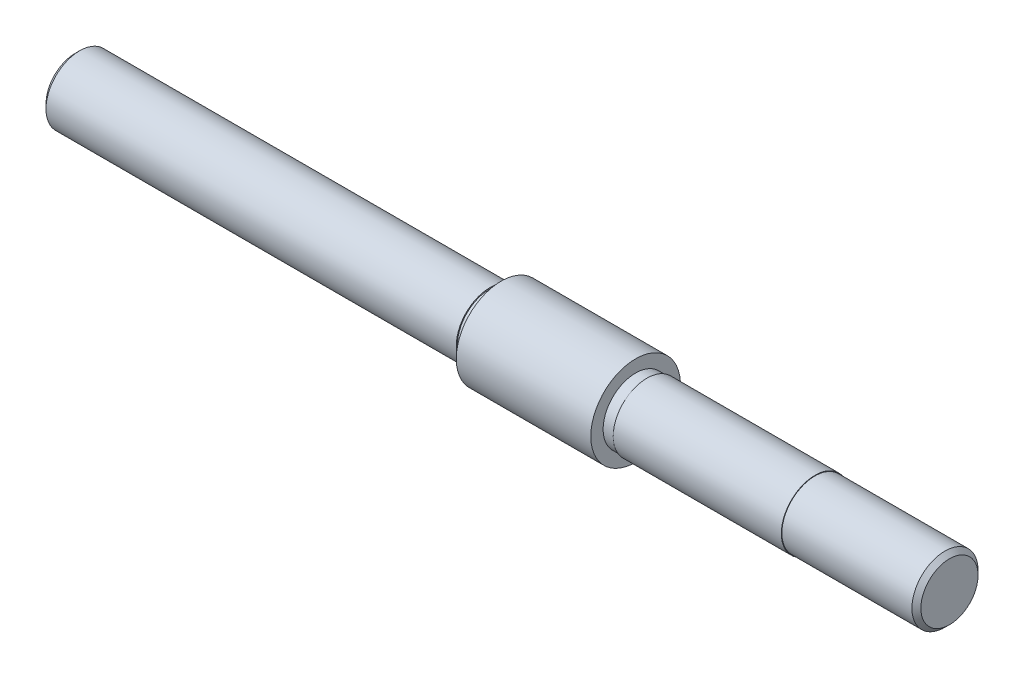
ISO-10303-21;
HEADER;
FILE_DESCRIPTION(('STEP AP214'),'2;1');
FILE_NAME('part.step','',(''),(''),'','','');
FILE_SCHEMA(('AUTOMOTIVE_DESIGN { 1 0 10303 214 1 1 1 1 }'));
ENDSEC;
DATA;
#1=APPLICATION_CONTEXT('core data for automotive mechanical design processes');
#2=APPLICATION_PROTOCOL_DEFINITION('international standard','automotive_design',2000,#1);
#3=PRODUCT_CONTEXT('',#1,'mechanical');
#4=PRODUCT('Part','Part','',(#3));
#5=PRODUCT_RELATED_PRODUCT_CATEGORY('part','',(#4));
#6=PRODUCT_DEFINITION_FORMATION('','',#4);
#7=PRODUCT_DEFINITION_CONTEXT('part definition',#1,'design');
#8=PRODUCT_DEFINITION('design','',#6,#7);
#9=PRODUCT_DEFINITION_SHAPE('','',#8);
#10=(LENGTH_UNIT() NAMED_UNIT(*) SI_UNIT(.MILLI.,.METRE.));
#11=(NAMED_UNIT(*) PLANE_ANGLE_UNIT() SI_UNIT($,.RADIAN.));
#12=(NAMED_UNIT(*) SI_UNIT($,.STERADIAN.) SOLID_ANGLE_UNIT());
#13=UNCERTAINTY_MEASURE_WITH_UNIT(LENGTH_MEASURE(1.E-05),#10,'distance_accuracy_value','');
#14=(GEOMETRIC_REPRESENTATION_CONTEXT(3) GLOBAL_UNCERTAINTY_ASSIGNED_CONTEXT((#13)) GLOBAL_UNIT_ASSIGNED_CONTEXT((#10,
#11,#12)) REPRESENTATION_CONTEXT('',''));
#15=CARTESIAN_POINT('',(0.,0.,0.));
#16=DIRECTION('',(0.,0.,1.));
#17=DIRECTION('',(1.,0.,0.));
#18=AXIS2_PLACEMENT_3D('',#15,#16,#17);
#19=CARTESIAN_POINT('',(0.,0.,0.));
#20=DIRECTION('',(-1.,0.,0.));
#21=DIRECTION('',(0.,0.,1.));
#22=AXIS2_PLACEMENT_3D('',#19,#20,#21);
#23=PLANE('',#22);
#24=CARTESIAN_POINT('',(0.,0.,0.));
#25=DIRECTION('',(-1.,0.,0.));
#26=DIRECTION('',(0.,0.,1.));
#27=AXIS2_PLACEMENT_3D('',#24,#25,#26);
#28=CIRCLE('',#27,1.27499999999999);
#29=CARTESIAN_POINT('',(0.,0.,1.27499999999999));
#30=VERTEX_POINT('',#29);
#31=EDGE_CURVE('E10',#30,#30,#28,.F.);
#32=ORIENTED_EDGE('',*,*,#31,.T.);
#33=EDGE_LOOP('',(#32));
#34=FACE_BOUND('',#33,.T.);
#35=ADVANCED_FACE('F37',(#34),#23,.F.);
#36=CARTESIAN_POINT('',(-12.0887675927148,0.,0.));
#37=DIRECTION('',(-1.,0.,0.));
#38=DIRECTION('',(0.,0.,1.));
#39=AXIS2_PLACEMENT_3D('',#36,#37,#38);
#40=CYLINDRICAL_SURFACE('',#39,1.475);
#41=CARTESIAN_POINT('',(-0.200000000000006,0.,0.));
#42=DIRECTION('',(-1.,0.,0.));
#43=DIRECTION('',(0.,0.,1.));
#44=AXIS2_PLACEMENT_3D('',#41,#42,#43);
#45=CIRCLE('',#44,1.475);
#46=CARTESIAN_POINT('',(-0.200000000000006,0.,1.475));
#47=VERTEX_POINT('',#46);
#48=EDGE_CURVE('E44',#47,#47,#45,.T.);
#49=ORIENTED_EDGE('',*,*,#48,.T.);
#50=EDGE_LOOP('',(#49));
#51=FACE_BOUND('',#50,.T.);
#52=CARTESIAN_POINT('',(-6.,0.,0.));
#53=DIRECTION('',(-1.,0.,0.));
#54=DIRECTION('',(0.,0.,1.));
#55=AXIS2_PLACEMENT_3D('',#52,#53,#54);
#56=CIRCLE('',#55,1.475);
#57=CARTESIAN_POINT('',(-6.,0.,1.475));
#58=VERTEX_POINT('',#57);
#59=EDGE_CURVE('E57',#58,#58,#56,.T.);
#60=ORIENTED_EDGE('',*,*,#59,.F.);
#61=EDGE_LOOP('',(#60));
#62=FACE_BOUND('',#61,.T.);
#63=ADVANCED_FACE('F141',(#51,#62),#40,.T.);
#64=CARTESIAN_POINT('',(-6.,1.475,0.));
#65=DIRECTION('',(-1.,0.,0.));
#66=DIRECTION('',(0.,0.,1.));
#67=AXIS2_PLACEMENT_3D('',#64,#65,#66);
#68=PLANE('',#67);
#69=CARTESIAN_POINT('',(-6.,0.,0.));
#70=DIRECTION('',(-1.,0.,0.));
#71=DIRECTION('',(0.,0.,1.));
#72=AXIS2_PLACEMENT_3D('',#69,#70,#71);
#73=CIRCLE('',#72,1.5);
#74=CARTESIAN_POINT('',(-6.,0.,1.5));
#75=VERTEX_POINT('',#74);
#76=EDGE_CURVE('E60',#75,#75,#73,.T.);
#77=ORIENTED_EDGE('',*,*,#76,.F.);
#78=EDGE_LOOP('',(#77));
#79=FACE_BOUND('',#78,.T.);
#80=ORIENTED_EDGE('',*,*,#59,.T.);
#81=EDGE_LOOP('',(#80));
#82=FACE_BOUND('',#81,.T.);
#83=ADVANCED_FACE('F135',(#79,#82),#68,.F.);
#84=CARTESIAN_POINT('',(-12.0887675927148,0.,0.));
#85=DIRECTION('',(-1.,0.,0.));
#86=DIRECTION('',(0.,0.,1.));
#87=AXIS2_PLACEMENT_3D('',#84,#85,#86);
#88=CYLINDRICAL_SURFACE('',#87,1.5);
#89=CARTESIAN_POINT('',(-13.5,0.,0.));
#90=DIRECTION('',(-1.,0.,0.));
#91=DIRECTION('',(0.,0.,1.));
#92=AXIS2_PLACEMENT_3D('',#89,#90,#91);
#93=CIRCLE('',#92,1.5);
#94=CARTESIAN_POINT('',(-13.5,0.,1.5));
#95=VERTEX_POINT('',#94);
#96=EDGE_CURVE('E63',#95,#95,#93,.T.);
#97=ORIENTED_EDGE('',*,*,#96,.F.);
#98=EDGE_LOOP('',(#97));
#99=FACE_BOUND('',#98,.T.);
#100=ORIENTED_EDGE('',*,*,#76,.T.);
#101=EDGE_LOOP('',(#100));
#102=FACE_BOUND('',#101,.T.);
#103=ADVANCED_FACE('F129',(#99,#102),#88,.T.);
#104=CARTESIAN_POINT('',(-13.5,1.5,0.));
#105=DIRECTION('',(1.,0.,0.));
#106=DIRECTION('',(0.,0.,-1.));
#107=AXIS2_PLACEMENT_3D('',#104,#105,#106);
#108=PLANE('',#107);
#109=CARTESIAN_POINT('',(-13.5,0.,0.));
#110=DIRECTION('',(-1.,0.,0.));
#111=DIRECTION('',(0.,0.,1.));
#112=AXIS2_PLACEMENT_3D('',#109,#110,#111);
#113=CIRCLE('',#112,1.45);
#114=CARTESIAN_POINT('',(-13.5,0.,1.45));
#115=VERTEX_POINT('',#114);
#116=EDGE_CURVE('E66',#115,#115,#113,.T.);
#117=ORIENTED_EDGE('',*,*,#116,.F.);
#118=EDGE_LOOP('',(#117));
#119=FACE_BOUND('',#118,.T.);
#120=ORIENTED_EDGE('',*,*,#96,.T.);
#121=EDGE_LOOP('',(#120));
#122=FACE_BOUND('',#121,.T.);
#123=ADVANCED_FACE('F123',(#119,#122),#108,.F.);
#124=CARTESIAN_POINT('',(-12.0887675927148,0.,0.));
#125=DIRECTION('',(-1.,0.,0.));
#126=DIRECTION('',(0.,0.,1.));
#127=AXIS2_PLACEMENT_3D('',#124,#125,#126);
#128=CYLINDRICAL_SURFACE('',#127,1.45);
#129=CARTESIAN_POINT('',(-14.,0.,0.));
#130=DIRECTION('',(-1.,0.,0.));
#131=DIRECTION('',(0.,0.,1.));
#132=AXIS2_PLACEMENT_3D('',#129,#130,#131);
#133=CIRCLE('',#132,1.45);
#134=CARTESIAN_POINT('',(-14.,0.,1.45));
#135=VERTEX_POINT('',#134);
#136=EDGE_CURVE('E69',#135,#135,#133,.T.);
#137=ORIENTED_EDGE('',*,*,#136,.F.);
#138=EDGE_LOOP('',(#137));
#139=FACE_BOUND('',#138,.T.);
#140=ORIENTED_EDGE('',*,*,#116,.T.);
#141=EDGE_LOOP('',(#140));
#142=FACE_BOUND('',#141,.T.);
#143=ADVANCED_FACE('F117',(#139,#142),#128,.T.);
#144=CARTESIAN_POINT('',(-14.,1.45,0.));
#145=DIRECTION('',(-1.,0.,0.));
#146=DIRECTION('',(0.,0.,1.));
#147=AXIS2_PLACEMENT_3D('',#144,#145,#146);
#148=PLANE('',#147);
#149=CARTESIAN_POINT('',(-14.,0.,0.));
#150=DIRECTION('',(-1.,0.,0.));
#151=DIRECTION('',(0.,0.,1.));
#152=AXIS2_PLACEMENT_3D('',#149,#150,#151);
#153=CIRCLE('',#152,2.);
#154=CARTESIAN_POINT('',(-14.,0.,2.));
#155=VERTEX_POINT('',#154);
#156=EDGE_CURVE('E72',#155,#155,#153,.T.);
#157=ORIENTED_EDGE('',*,*,#156,.F.);
#158=EDGE_LOOP('',(#157));
#159=FACE_BOUND('',#158,.T.);
#160=ORIENTED_EDGE('',*,*,#136,.T.);
#161=EDGE_LOOP('',(#160));
#162=FACE_BOUND('',#161,.T.);
#163=ADVANCED_FACE('F111',(#159,#162),#148,.F.);
#164=CARTESIAN_POINT('',(-12.0887675927148,0.,0.));
#165=DIRECTION('',(-1.,0.,0.));
#166=DIRECTION('',(0.,0.,1.));
#167=AXIS2_PLACEMENT_3D('',#164,#165,#166);
#168=CYLINDRICAL_SURFACE('',#167,2.);
#169=CARTESIAN_POINT('',(-20.,0.,0.));
#170=DIRECTION('',(-1.,0.,0.));
#171=DIRECTION('',(0.,0.,1.));
#172=AXIS2_PLACEMENT_3D('',#169,#170,#171);
#173=CIRCLE('',#172,2.);
#174=CARTESIAN_POINT('',(-20.,0.,2.));
#175=VERTEX_POINT('',#174);
#176=EDGE_CURVE('E75',#175,#175,#173,.T.);
#177=ORIENTED_EDGE('',*,*,#176,.F.);
#178=EDGE_LOOP('',(#177));
#179=FACE_BOUND('',#178,.T.);
#180=ORIENTED_EDGE('',*,*,#156,.T.);
#181=EDGE_LOOP('',(#180));
#182=FACE_BOUND('',#181,.T.);
#183=ADVANCED_FACE('F105',(#179,#182),#168,.T.);
#184=CARTESIAN_POINT('',(-20.,2.,0.));
#185=DIRECTION('',(1.,0.,0.));
#186=DIRECTION('',(0.,0.,-1.));
#187=AXIS2_PLACEMENT_3D('',#184,#185,#186);
#188=PLANE('',#187);
#189=CARTESIAN_POINT('',(-20.,0.,0.));
#190=DIRECTION('',(-1.,0.,0.));
#191=DIRECTION('',(0.,0.,1.));
#192=AXIS2_PLACEMENT_3D('',#189,#190,#191);
#193=CIRCLE('',#192,1.45);
#194=CARTESIAN_POINT('',(-20.,0.,1.45));
#195=VERTEX_POINT('',#194);
#196=EDGE_CURVE('E78',#195,#195,#193,.T.);
#197=ORIENTED_EDGE('',*,*,#196,.F.);
#198=EDGE_LOOP('',(#197));
#199=FACE_BOUND('',#198,.T.);
#200=ORIENTED_EDGE('',*,*,#176,.T.);
#201=EDGE_LOOP('',(#200));
#202=FACE_BOUND('',#201,.T.);
#203=ADVANCED_FACE('F99',(#199,#202),#188,.F.);
#204=CARTESIAN_POINT('',(-12.0887675927148,0.,0.));
#205=DIRECTION('',(-1.,0.,0.));
#206=DIRECTION('',(0.,0.,1.));
#207=AXIS2_PLACEMENT_3D('',#204,#205,#206);
#208=CYLINDRICAL_SURFACE('',#207,1.45);
#209=CARTESIAN_POINT('',(-20.5,0.,0.));
#210=DIRECTION('',(-1.,0.,0.));
#211=DIRECTION('',(0.,0.,1.));
#212=AXIS2_PLACEMENT_3D('',#209,#210,#211);
#213=CIRCLE('',#212,1.45);
#214=CARTESIAN_POINT('',(-20.5,0.,1.45));
#215=VERTEX_POINT('',#214);
#216=EDGE_CURVE('E81',#215,#215,#213,.T.);
#217=ORIENTED_EDGE('',*,*,#216,.F.);
#218=EDGE_LOOP('',(#217));
#219=FACE_BOUND('',#218,.T.);
#220=ORIENTED_EDGE('',*,*,#196,.T.);
#221=EDGE_LOOP('',(#220));
#222=FACE_BOUND('',#221,.T.);
#223=ADVANCED_FACE('F93',(#219,#222),#208,.T.);
#224=CARTESIAN_POINT('',(-20.5,1.5,0.));
#225=DIRECTION('',(-1.,0.,0.));
#226=DIRECTION('',(0.,0.,1.));
#227=AXIS2_PLACEMENT_3D('',#224,#225,#226);
#228=PLANE('',#227);
#229=CARTESIAN_POINT('',(-20.5,0.,0.));
#230=DIRECTION('',(-1.,0.,0.));
#231=DIRECTION('',(0.,0.,1.));
#232=AXIS2_PLACEMENT_3D('',#229,#230,#231);
#233=CIRCLE('',#232,1.5);
#234=CARTESIAN_POINT('',(-20.5,0.,1.5));
#235=VERTEX_POINT('',#234);
#236=EDGE_CURVE('E84',#235,#235,#233,.T.);
#237=ORIENTED_EDGE('',*,*,#236,.F.);
#238=EDGE_LOOP('',(#237));
#239=FACE_BOUND('',#238,.T.);
#240=ORIENTED_EDGE('',*,*,#216,.T.);
#241=EDGE_LOOP('',(#240));
#242=FACE_BOUND('',#241,.T.);
#243=ADVANCED_FACE('F90',(#239,#242),#228,.F.);
#244=CARTESIAN_POINT('',(-12.0887675927148,0.,0.));
#245=DIRECTION('',(-1.,0.,0.));
#246=DIRECTION('',(0.,0.,1.));
#247=AXIS2_PLACEMENT_3D('',#244,#245,#246);
#248=CYLINDRICAL_SURFACE('',#247,1.5);
#249=CARTESIAN_POINT('',(-38.8,0.,0.));
#250=DIRECTION('',(1.,0.,0.));
#251=DIRECTION('',(0.,0.,-1.));
#252=AXIS2_PLACEMENT_3D('',#249,#250,#251);
#253=CIRCLE('',#252,1.5);
#254=CARTESIAN_POINT('',(-38.8,0.,-1.5));
#255=VERTEX_POINT('',#254);
#256=EDGE_CURVE('E48',#255,#255,#253,.T.);
#257=ORIENTED_EDGE('',*,*,#256,.T.);
#258=EDGE_LOOP('',(#257));
#259=FACE_BOUND('',#258,.T.);
#260=ORIENTED_EDGE('',*,*,#236,.T.);
#261=EDGE_LOOP('',(#260));
#262=FACE_BOUND('',#261,.T.);
#263=ADVANCED_FACE('F88',(#259,#262),#248,.T.);
#264=CARTESIAN_POINT('',(-39.,1.5,0.));
#265=DIRECTION('',(1.,0.,0.));
#266=DIRECTION('',(0.,0.,-1.));
#267=AXIS2_PLACEMENT_3D('',#264,#265,#266);
#268=PLANE('',#267);
#269=CARTESIAN_POINT('',(-39.,0.,0.));
#270=DIRECTION('',(1.,0.,0.));
#271=DIRECTION('',(0.,0.,-1.));
#272=AXIS2_PLACEMENT_3D('',#269,#270,#271);
#273=CIRCLE('',#272,1.3);
#274=CARTESIAN_POINT('',(-39.,0.,-1.3));
#275=VERTEX_POINT('',#274);
#276=EDGE_CURVE('E52',#275,#275,#273,.F.);
#277=ORIENTED_EDGE('',*,*,#276,.T.);
#278=EDGE_LOOP('',(#277));
#279=FACE_BOUND('',#278,.T.);
#280=ADVANCED_FACE('F153',(#279),#268,.F.);
#281=CARTESIAN_POINT('',(-39.,0.,0.));
#282=DIRECTION('',(1.,0.,0.));
#283=DIRECTION('',(0.,0.,-1.));
#284=AXIS2_PLACEMENT_3D('',#281,#282,#283);
#285=CONICAL_SURFACE('',#284,1.3,0.785398163397451);
#286=ORIENTED_EDGE('',*,*,#256,.F.);
#287=EDGE_LOOP('',(#286));
#288=FACE_BOUND('',#287,.T.);
#289=ORIENTED_EDGE('',*,*,#276,.F.);
#290=EDGE_LOOP('',(#289));
#291=FACE_BOUND('',#290,.T.);
#292=ADVANCED_FACE('F151',(#288,#291),#285,.T.);
#293=CARTESIAN_POINT('',(-0.200000000000006,0.,0.));
#294=DIRECTION('',(-1.,0.,0.));
#295=DIRECTION('',(0.,0.,1.));
#296=AXIS2_PLACEMENT_3D('',#293,#294,#295);
#297=CONICAL_SURFACE('',#296,1.475,0.785398163397446);
#298=ORIENTED_EDGE('',*,*,#31,.F.);
#299=EDGE_LOOP('',(#298));
#300=FACE_BOUND('',#299,.T.);
#301=ORIENTED_EDGE('',*,*,#48,.F.);
#302=EDGE_LOOP('',(#301));
#303=FACE_BOUND('',#302,.T.);
#304=ADVANCED_FACE('F39',(#300,#303),#297,.T.);
#305=CLOSED_SHELL('',(#35,#63,#83,#103,#123,#143,#163,#183,#203,#223,#243,#263,#280,#292,#304));
#306=MANIFOLD_SOLID_BREP('B2',#305);
#307=ADVANCED_BREP_SHAPE_REPRESENTATION('',(#18,#306),#14);
#308=SHAPE_DEFINITION_REPRESENTATION(#9,#307);
ENDSEC;
END-ISO-10303-21;
